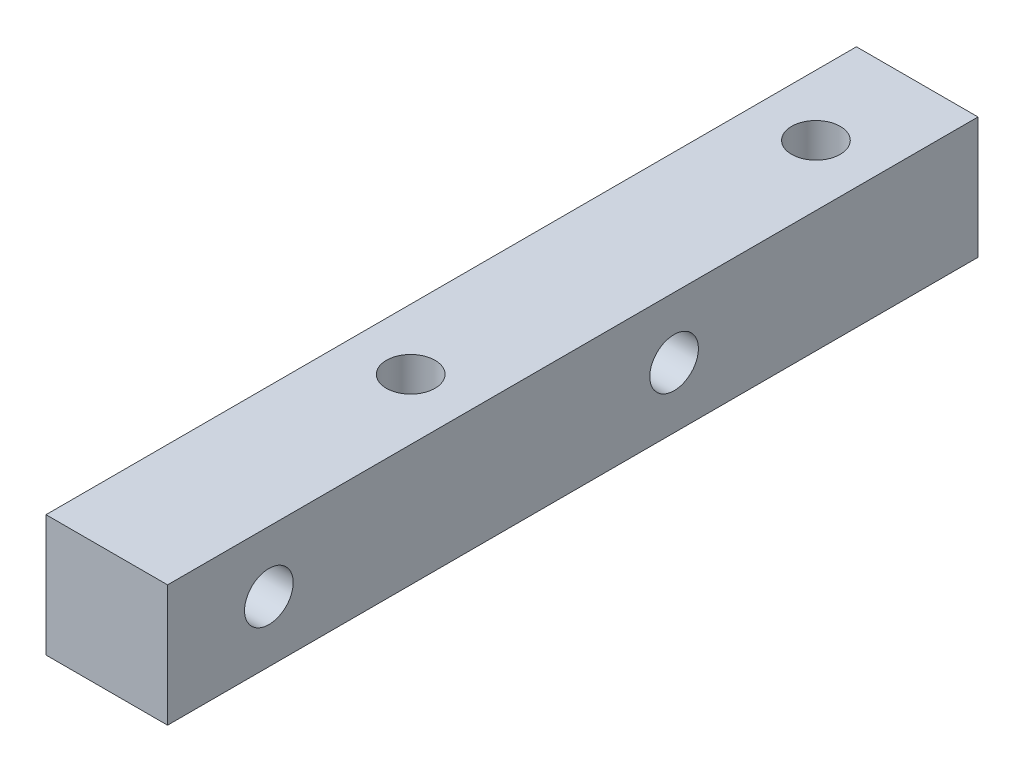
ISO-10303-21;
HEADER;
FILE_DESCRIPTION(('STEP AP214'),'2;1');
FILE_NAME('part.step','',(''),(''),'','','');
FILE_SCHEMA(('AUTOMOTIVE_DESIGN { 1 0 10303 214 1 1 1 1 }'));
ENDSEC;
DATA;
#1=APPLICATION_CONTEXT('core data for automotive mechanical design processes');
#2=APPLICATION_PROTOCOL_DEFINITION('international standard','automotive_design',2000,#1);
#3=PRODUCT_CONTEXT('',#1,'mechanical');
#4=PRODUCT('Part','Part','',(#3));
#5=PRODUCT_RELATED_PRODUCT_CATEGORY('part','',(#4));
#6=PRODUCT_DEFINITION_FORMATION('','',#4);
#7=PRODUCT_DEFINITION_CONTEXT('part definition',#1,'design');
#8=PRODUCT_DEFINITION('design','',#6,#7);
#9=PRODUCT_DEFINITION_SHAPE('','',#8);
#10=(LENGTH_UNIT() NAMED_UNIT(*) SI_UNIT(.MILLI.,.METRE.));
#11=(NAMED_UNIT(*) PLANE_ANGLE_UNIT() SI_UNIT($,.RADIAN.));
#12=(NAMED_UNIT(*) SI_UNIT($,.STERADIAN.) SOLID_ANGLE_UNIT());
#13=UNCERTAINTY_MEASURE_WITH_UNIT(LENGTH_MEASURE(1.E-05),#10,'distance_accuracy_value','');
#14=(GEOMETRIC_REPRESENTATION_CONTEXT(3) GLOBAL_UNCERTAINTY_ASSIGNED_CONTEXT((#13)) GLOBAL_UNIT_ASSIGNED_CONTEXT((#10,
#11,#12)) REPRESENTATION_CONTEXT('',''));
#15=CARTESIAN_POINT('',(0.,0.,0.));
#16=DIRECTION('',(0.,0.,1.));
#17=DIRECTION('',(1.,0.,0.));
#18=AXIS2_PLACEMENT_3D('',#15,#16,#17);
#19=CARTESIAN_POINT('',(6.,6.,0.));
#20=DIRECTION('',(0.,0.,-1.));
#21=DIRECTION('',(-1.,0.,0.));
#22=AXIS2_PLACEMENT_3D('',#19,#20,#21);
#23=PLANE('',#22);
#24=DIRECTION('',(0.,-1.,0.));
#25=VECTOR('',#24,1.);
#26=CARTESIAN_POINT('',(0.,6.,0.));
#27=LINE('',#26,#25);
#28=CARTESIAN_POINT('',(0.,6.,0.));
#29=VERTEX_POINT('',#28);
#30=CARTESIAN_POINT('',(0.,0.,0.));
#31=VERTEX_POINT('',#30);
#32=EDGE_CURVE('E103',#29,#31,#27,.T.);
#33=ORIENTED_EDGE('',*,*,#32,.F.);
#34=DIRECTION('',(-1.,0.,0.));
#35=VECTOR('',#34,1.);
#36=CARTESIAN_POINT('',(6.,6.,0.));
#37=LINE('',#36,#35);
#38=CARTESIAN_POINT('',(6.,6.,0.));
#39=VERTEX_POINT('',#38);
#40=EDGE_CURVE('E11',#39,#29,#37,.T.);
#41=ORIENTED_EDGE('',*,*,#40,.F.);
#42=DIRECTION('',(0.,-1.,0.));
#43=VECTOR('',#42,1.);
#44=CARTESIAN_POINT('',(6.,6.,0.));
#45=LINE('',#44,#43);
#46=CARTESIAN_POINT('',(6.,0.,0.));
#47=VERTEX_POINT('',#46);
#48=EDGE_CURVE('E96',#39,#47,#45,.T.);
#49=ORIENTED_EDGE('',*,*,#48,.T.);
#50=DIRECTION('',(-1.,0.,0.));
#51=VECTOR('',#50,1.);
#52=CARTESIAN_POINT('',(6.,0.,0.));
#53=LINE('',#52,#51);
#54=EDGE_CURVE('E41',#47,#31,#53,.T.);
#55=ORIENTED_EDGE('',*,*,#54,.T.);
#56=EDGE_LOOP('',(#33,#41,#49,#55));
#57=FACE_BOUND('',#56,.T.);
#58=ADVANCED_FACE('F38',(#57),#23,.T.);
#59=CARTESIAN_POINT('',(6.,6.,40.));
#60=DIRECTION('',(0.,1.,0.));
#61=DIRECTION('',(0.,0.,1.));
#62=AXIS2_PLACEMENT_3D('',#59,#60,#61);
#63=PLANE('',#62);
#64=CARTESIAN_POINT('',(3.,6.,5.));
#65=DIRECTION('',(0.,1.,0.));
#66=DIRECTION('',(0.,0.,1.));
#67=AXIS2_PLACEMENT_3D('',#64,#65,#66);
#68=CIRCLE('',#67,1.19999999999999);
#69=CARTESIAN_POINT('',(3.,6.,6.19999999999999));
#70=VERTEX_POINT('',#69);
#71=EDGE_CURVE('E145',#70,#70,#68,.T.);
#72=ORIENTED_EDGE('',*,*,#71,.F.);
#73=EDGE_LOOP('',(#72));
#74=FACE_BOUND('',#73,.T.);
#75=CARTESIAN_POINT('',(3.,6.,25.));
#76=DIRECTION('',(0.,1.,0.));
#77=DIRECTION('',(0.,0.,1.));
#78=AXIS2_PLACEMENT_3D('',#75,#76,#77);
#79=CIRCLE('',#78,1.19999999999999);
#80=CARTESIAN_POINT('',(3.,6.,26.2));
#81=VERTEX_POINT('',#80);
#82=EDGE_CURVE('E140',#81,#81,#79,.T.);
#83=ORIENTED_EDGE('',*,*,#82,.F.);
#84=EDGE_LOOP('',(#83));
#85=FACE_BOUND('',#84,.T.);
#86=DIRECTION('',(0.,0.,-1.));
#87=VECTOR('',#86,1.);
#88=CARTESIAN_POINT('',(0.,6.,40.));
#89=LINE('',#88,#87);
#90=CARTESIAN_POINT('',(0.,6.,40.));
#91=VERTEX_POINT('',#90);
#92=EDGE_CURVE('E98',#91,#29,#89,.T.);
#93=ORIENTED_EDGE('',*,*,#92,.F.);
#94=DIRECTION('',(-1.,0.,0.));
#95=VECTOR('',#94,1.);
#96=CARTESIAN_POINT('',(6.,6.,40.));
#97=LINE('',#96,#95);
#98=CARTESIAN_POINT('',(6.,6.,40.));
#99=VERTEX_POINT('',#98);
#100=EDGE_CURVE('E47',#99,#91,#97,.T.);
#101=ORIENTED_EDGE('',*,*,#100,.F.);
#102=DIRECTION('',(0.,0.,-1.));
#103=VECTOR('',#102,1.);
#104=CARTESIAN_POINT('',(6.,6.,40.));
#105=LINE('',#104,#103);
#106=EDGE_CURVE('E93',#99,#39,#105,.T.);
#107=ORIENTED_EDGE('',*,*,#106,.T.);
#108=ORIENTED_EDGE('',*,*,#40,.T.);
#109=EDGE_LOOP('',(#93,#101,#107,#108));
#110=FACE_BOUND('',#109,.T.);
#111=ADVANCED_FACE('F114',(#74,#85,#110),#63,.T.);
#112=CARTESIAN_POINT('',(6.,0.,40.));
#113=DIRECTION('',(0.,0.,1.));
#114=DIRECTION('',(1.,0.,0.));
#115=AXIS2_PLACEMENT_3D('',#112,#113,#114);
#116=PLANE('',#115);
#117=DIRECTION('',(0.,1.,0.));
#118=VECTOR('',#117,1.);
#119=CARTESIAN_POINT('',(0.,0.,40.));
#120=LINE('',#119,#118);
#121=CARTESIAN_POINT('',(0.,0.,40.));
#122=VERTEX_POINT('',#121);
#123=EDGE_CURVE('E88',#122,#91,#120,.T.);
#124=ORIENTED_EDGE('',*,*,#123,.F.);
#125=DIRECTION('',(-1.,0.,0.));
#126=VECTOR('',#125,1.);
#127=CARTESIAN_POINT('',(6.,0.,40.));
#128=LINE('',#127,#126);
#129=CARTESIAN_POINT('',(6.,0.,40.));
#130=VERTEX_POINT('',#129);
#131=EDGE_CURVE('E83',#130,#122,#128,.T.);
#132=ORIENTED_EDGE('',*,*,#131,.F.);
#133=DIRECTION('',(0.,1.,0.));
#134=VECTOR('',#133,1.);
#135=CARTESIAN_POINT('',(6.,0.,40.));
#136=LINE('',#135,#134);
#137=EDGE_CURVE('E86',#130,#99,#136,.T.);
#138=ORIENTED_EDGE('',*,*,#137,.T.);
#139=ORIENTED_EDGE('',*,*,#100,.T.);
#140=EDGE_LOOP('',(#124,#132,#138,#139));
#141=FACE_BOUND('',#140,.T.);
#142=ADVANCED_FACE('F85',(#141),#116,.T.);
#143=CARTESIAN_POINT('',(6.,0.,0.));
#144=DIRECTION('',(0.,-1.,0.));
#145=DIRECTION('',(0.,0.,-1.));
#146=AXIS2_PLACEMENT_3D('',#143,#144,#145);
#147=PLANE('',#146);
#148=CARTESIAN_POINT('',(3.,0.,5.));
#149=DIRECTION('',(0.,1.,0.));
#150=DIRECTION('',(0.,0.,1.));
#151=AXIS2_PLACEMENT_3D('',#148,#149,#150);
#152=CIRCLE('',#151,1.19999999999999);
#153=CARTESIAN_POINT('',(3.,0.,6.19999999999999));
#154=VERTEX_POINT('',#153);
#155=EDGE_CURVE('E136',#154,#154,#152,.T.);
#156=ORIENTED_EDGE('',*,*,#155,.T.);
#157=EDGE_LOOP('',(#156));
#158=FACE_BOUND('',#157,.T.);
#159=CARTESIAN_POINT('',(3.,0.,25.));
#160=DIRECTION('',(0.,1.,0.));
#161=DIRECTION('',(0.,0.,1.));
#162=AXIS2_PLACEMENT_3D('',#159,#160,#161);
#163=CIRCLE('',#162,1.19999999999999);
#164=CARTESIAN_POINT('',(3.,0.,26.2));
#165=VERTEX_POINT('',#164);
#166=EDGE_CURVE('E107',#165,#165,#163,.T.);
#167=ORIENTED_EDGE('',*,*,#166,.T.);
#168=EDGE_LOOP('',(#167));
#169=FACE_BOUND('',#168,.T.);
#170=DIRECTION('',(0.,0.,1.));
#171=VECTOR('',#170,1.);
#172=CARTESIAN_POINT('',(0.,0.,0.));
#173=LINE('',#172,#171);
#174=EDGE_CURVE('E106',#31,#122,#173,.T.);
#175=ORIENTED_EDGE('',*,*,#174,.F.);
#176=ORIENTED_EDGE('',*,*,#54,.F.);
#177=DIRECTION('',(0.,0.,1.));
#178=VECTOR('',#177,1.);
#179=CARTESIAN_POINT('',(6.,0.,0.));
#180=LINE('',#179,#178);
#181=EDGE_CURVE('E92',#47,#130,#180,.T.);
#182=ORIENTED_EDGE('',*,*,#181,.T.);
#183=ORIENTED_EDGE('',*,*,#131,.T.);
#184=EDGE_LOOP('',(#175,#176,#182,#183));
#185=FACE_BOUND('',#184,.T.);
#186=ADVANCED_FACE('F95',(#158,#169,#185),#147,.T.);
#187=CARTESIAN_POINT('',(6.,0.,0.));
#188=DIRECTION('',(-1.,0.,0.));
#189=DIRECTION('',(0.,0.,1.));
#190=AXIS2_PLACEMENT_3D('',#187,#188,#189);
#191=PLANE('',#190);
#192=CARTESIAN_POINT('',(5.99999999999999,3.,35.));
#193=DIRECTION('',(-1.,0.,0.));
#194=DIRECTION('',(0.,0.,1.));
#195=AXIS2_PLACEMENT_3D('',#192,#193,#194);
#196=CIRCLE('',#195,1.19999999999999);
#197=CARTESIAN_POINT('',(5.99999999999999,3.,36.2));
#198=VERTEX_POINT('',#197);
#199=EDGE_CURVE('E154',#198,#198,#196,.T.);
#200=ORIENTED_EDGE('',*,*,#199,.T.);
#201=EDGE_LOOP('',(#200));
#202=FACE_BOUND('',#201,.T.);
#203=CARTESIAN_POINT('',(5.99999999999999,3.,15.));
#204=DIRECTION('',(-1.,0.,0.));
#205=DIRECTION('',(0.,0.,1.));
#206=AXIS2_PLACEMENT_3D('',#203,#204,#205);
#207=CIRCLE('',#206,1.19999999999999);
#208=CARTESIAN_POINT('',(5.99999999999999,3.,16.2));
#209=VERTEX_POINT('',#208);
#210=EDGE_CURVE('E148',#209,#209,#207,.T.);
#211=ORIENTED_EDGE('',*,*,#210,.T.);
#212=EDGE_LOOP('',(#211));
#213=FACE_BOUND('',#212,.T.);
#214=ORIENTED_EDGE('',*,*,#48,.F.);
#215=ORIENTED_EDGE('',*,*,#106,.F.);
#216=ORIENTED_EDGE('',*,*,#137,.F.);
#217=ORIENTED_EDGE('',*,*,#181,.F.);
#218=EDGE_LOOP('',(#214,#215,#216,#217));
#219=FACE_BOUND('',#218,.T.);
#220=ADVANCED_FACE('F91',(#202,#213,#219),#191,.F.);
#221=CARTESIAN_POINT('',(0.,0.,0.));
#222=DIRECTION('',(-1.,0.,0.));
#223=DIRECTION('',(0.,0.,1.));
#224=AXIS2_PLACEMENT_3D('',#221,#222,#223);
#225=PLANE('',#224);
#226=CARTESIAN_POINT('',(0.,3.,35.));
#227=DIRECTION('',(-1.,0.,0.));
#228=DIRECTION('',(0.,0.,1.));
#229=AXIS2_PLACEMENT_3D('',#226,#227,#228);
#230=CIRCLE('',#229,1.19999999999999);
#231=CARTESIAN_POINT('',(0.,3.,36.2));
#232=VERTEX_POINT('',#231);
#233=EDGE_CURVE('E157',#232,#232,#230,.T.);
#234=ORIENTED_EDGE('',*,*,#233,.F.);
#235=EDGE_LOOP('',(#234));
#236=FACE_BOUND('',#235,.T.);
#237=CARTESIAN_POINT('',(0.,3.,15.));
#238=DIRECTION('',(-1.,0.,0.));
#239=DIRECTION('',(0.,0.,1.));
#240=AXIS2_PLACEMENT_3D('',#237,#238,#239);
#241=CIRCLE('',#240,1.19999999999999);
#242=CARTESIAN_POINT('',(0.,3.,16.2));
#243=VERTEX_POINT('',#242);
#244=EDGE_CURVE('E151',#243,#243,#241,.T.);
#245=ORIENTED_EDGE('',*,*,#244,.F.);
#246=EDGE_LOOP('',(#245));
#247=FACE_BOUND('',#246,.T.);
#248=ORIENTED_EDGE('',*,*,#32,.T.);
#249=ORIENTED_EDGE('',*,*,#174,.T.);
#250=ORIENTED_EDGE('',*,*,#123,.T.);
#251=ORIENTED_EDGE('',*,*,#92,.T.);
#252=EDGE_LOOP('',(#248,#249,#250,#251));
#253=FACE_BOUND('',#252,.T.);
#254=ADVANCED_FACE('F113',(#236,#247,#253),#225,.T.);
#255=CARTESIAN_POINT('',(3.,6.,25.));
#256=DIRECTION('',(0.,1.,0.));
#257=DIRECTION('',(0.,0.,1.));
#258=AXIS2_PLACEMENT_3D('',#255,#256,#257);
#259=CYLINDRICAL_SURFACE('',#258,1.19999999999999);
#260=ORIENTED_EDGE('',*,*,#166,.F.);
#261=EDGE_LOOP('',(#260));
#262=FACE_BOUND('',#261,.T.);
#263=ORIENTED_EDGE('',*,*,#82,.T.);
#264=EDGE_LOOP('',(#263));
#265=FACE_BOUND('',#264,.T.);
#266=ADVANCED_FACE('F165',(#262,#265),#259,.F.);
#267=CARTESIAN_POINT('',(3.,6.,5.));
#268=DIRECTION('',(0.,1.,0.));
#269=DIRECTION('',(0.,0.,1.));
#270=AXIS2_PLACEMENT_3D('',#267,#268,#269);
#271=CYLINDRICAL_SURFACE('',#270,1.19999999999999);
#272=ORIENTED_EDGE('',*,*,#155,.F.);
#273=EDGE_LOOP('',(#272));
#274=FACE_BOUND('',#273,.T.);
#275=ORIENTED_EDGE('',*,*,#71,.T.);
#276=EDGE_LOOP('',(#275));
#277=FACE_BOUND('',#276,.T.);
#278=ADVANCED_FACE('F170',(#274,#277),#271,.F.);
#279=CARTESIAN_POINT('',(0.,3.,15.));
#280=DIRECTION('',(-1.,0.,0.));
#281=DIRECTION('',(0.,0.,1.));
#282=AXIS2_PLACEMENT_3D('',#279,#280,#281);
#283=CYLINDRICAL_SURFACE('',#282,1.19999999999999);
#284=ORIENTED_EDGE('',*,*,#210,.F.);
#285=EDGE_LOOP('',(#284));
#286=FACE_BOUND('',#285,.T.);
#287=ORIENTED_EDGE('',*,*,#244,.T.);
#288=EDGE_LOOP('',(#287));
#289=FACE_BOUND('',#288,.T.);
#290=ADVANCED_FACE('F168',(#286,#289),#283,.F.);
#291=CARTESIAN_POINT('',(0.,3.,35.));
#292=DIRECTION('',(-1.,0.,0.));
#293=DIRECTION('',(0.,0.,1.));
#294=AXIS2_PLACEMENT_3D('',#291,#292,#293);
#295=CYLINDRICAL_SURFACE('',#294,1.19999999999999);
#296=ORIENTED_EDGE('',*,*,#199,.F.);
#297=EDGE_LOOP('',(#296));
#298=FACE_BOUND('',#297,.T.);
#299=ORIENTED_EDGE('',*,*,#233,.T.);
#300=EDGE_LOOP('',(#299));
#301=FACE_BOUND('',#300,.T.);
#302=ADVANCED_FACE('F161',(#298,#301),#295,.F.);
#303=CLOSED_SHELL('',(#58,#111,#142,#186,#220,#254,#266,#278,#290,#302));
#304=MANIFOLD_SOLID_BREP('B2',#303);
#305=ADVANCED_BREP_SHAPE_REPRESENTATION('',(#18,#304),#14);
#306=SHAPE_DEFINITION_REPRESENTATION(#9,#305);
ENDSEC;
END-ISO-10303-21;
